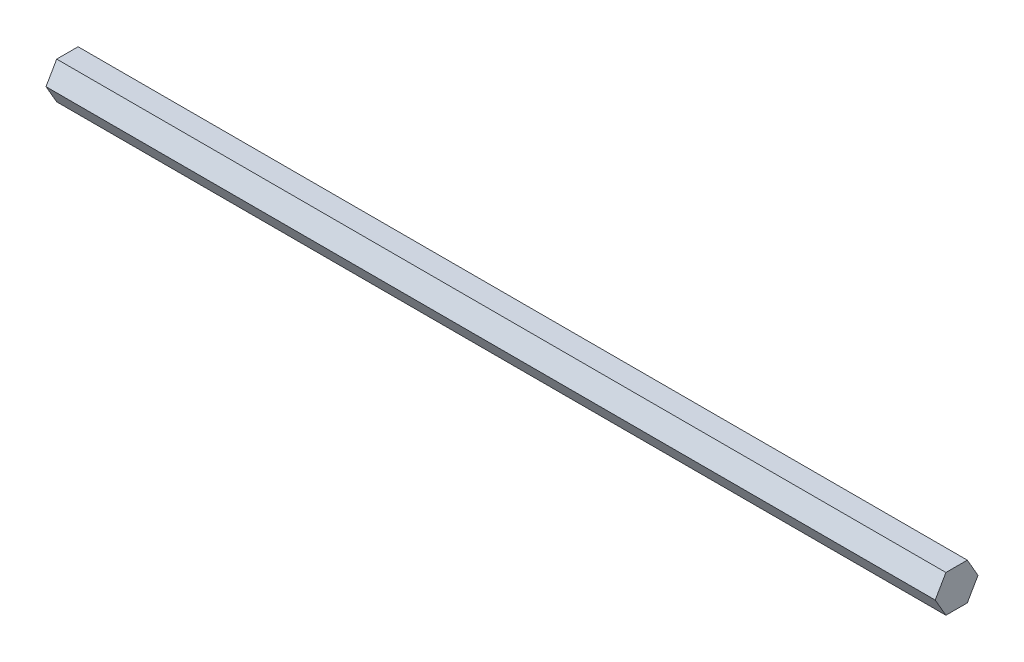
ISO-10303-21;
HEADER;
FILE_DESCRIPTION(('STEP AP214'),'2;1');
FILE_NAME('part.step','',(''),(''),'','','');
FILE_SCHEMA(('AUTOMOTIVE_DESIGN { 1 0 10303 214 1 1 1 1 }'));
ENDSEC;
DATA;
#1=APPLICATION_CONTEXT('core data for automotive mechanical design processes');
#2=APPLICATION_PROTOCOL_DEFINITION('international standard','automotive_design',2000,#1);
#3=PRODUCT_CONTEXT('',#1,'mechanical');
#4=PRODUCT('Part','Part','',(#3));
#5=PRODUCT_RELATED_PRODUCT_CATEGORY('part','',(#4));
#6=PRODUCT_DEFINITION_FORMATION('','',#4);
#7=PRODUCT_DEFINITION_CONTEXT('part definition',#1,'design');
#8=PRODUCT_DEFINITION('design','',#6,#7);
#9=PRODUCT_DEFINITION_SHAPE('','',#8);
#10=(LENGTH_UNIT() NAMED_UNIT(*) SI_UNIT(.MILLI.,.METRE.));
#11=(NAMED_UNIT(*) PLANE_ANGLE_UNIT() SI_UNIT($,.RADIAN.));
#12=(NAMED_UNIT(*) SI_UNIT($,.STERADIAN.) SOLID_ANGLE_UNIT());
#13=UNCERTAINTY_MEASURE_WITH_UNIT(LENGTH_MEASURE(1.E-05),#10,'distance_accuracy_value','');
#14=(GEOMETRIC_REPRESENTATION_CONTEXT(3) GLOBAL_UNCERTAINTY_ASSIGNED_CONTEXT((#13)) GLOBAL_UNIT_ASSIGNED_CONTEXT((#10,
#11,#12)) REPRESENTATION_CONTEXT('',''));
#15=CARTESIAN_POINT('',(0.,0.,0.));
#16=DIRECTION('',(0.,0.,1.));
#17=DIRECTION('',(1.,0.,0.));
#18=AXIS2_PLACEMENT_3D('',#15,#16,#17);
#19=CARTESIAN_POINT('',(152.4,0.,-7.33234841870825));
#20=DIRECTION('',(0.,-0.5,0.866025403784438));
#21=DIRECTION('',(0.,-0.866025403784438,-0.5));
#22=AXIS2_PLACEMENT_3D('',#19,#20,#21);
#23=PLANE('',#22);
#24=DIRECTION('',(0.,0.866025403784438,0.5));
#25=VECTOR('',#24,1.);
#26=CARTESIAN_POINT('',(-152.4,0.,-7.33234841870825));
#27=LINE('',#26,#25);
#28=CARTESIAN_POINT('',(-152.4,0.,-7.33234841870825));
#29=VERTEX_POINT('',#28);
#30=CARTESIAN_POINT('',(-152.4,6.35,-3.66617420935412));
#31=VERTEX_POINT('',#30);
#32=EDGE_CURVE('E128',#29,#31,#27,.T.);
#33=ORIENTED_EDGE('',*,*,#32,.T.);
#34=DIRECTION('',(-1.,0.,0.));
#35=VECTOR('',#34,1.);
#36=CARTESIAN_POINT('',(152.4,6.35,-3.66617420935412));
#37=LINE('',#36,#35);
#38=CARTESIAN_POINT('',(152.4,6.35,-3.66617420935412));
#39=VERTEX_POINT('',#38);
#40=EDGE_CURVE('E11',#39,#31,#37,.T.);
#41=ORIENTED_EDGE('',*,*,#40,.F.);
#42=DIRECTION('',(0.,0.866025403784438,0.5));
#43=VECTOR('',#42,1.);
#44=CARTESIAN_POINT('',(152.4,0.,-7.33234841870825));
#45=LINE('',#44,#43);
#46=CARTESIAN_POINT('',(152.4,0.,-7.33234841870825));
#47=VERTEX_POINT('',#46);
#48=EDGE_CURVE('E144',#47,#39,#45,.T.);
#49=ORIENTED_EDGE('',*,*,#48,.F.);
#50=DIRECTION('',(-1.,0.,0.));
#51=VECTOR('',#50,1.);
#52=CARTESIAN_POINT('',(152.4,0.,-7.33234841870825));
#53=LINE('',#52,#51);
#54=EDGE_CURVE('E124',#47,#29,#53,.T.);
#55=ORIENTED_EDGE('',*,*,#54,.T.);
#56=EDGE_LOOP('',(#33,#41,#49,#55));
#57=FACE_BOUND('',#56,.T.);
#58=ADVANCED_FACE('F39',(#57),#23,.F.);
#59=CARTESIAN_POINT('',(152.4,6.35,-3.66617420935412));
#60=DIRECTION('',(0.,-1.,0.));
#61=DIRECTION('',(0.,0.,-1.));
#62=AXIS2_PLACEMENT_3D('',#59,#60,#61);
#63=PLANE('',#62);
#64=DIRECTION('',(0.,0.,1.));
#65=VECTOR('',#64,1.);
#66=CARTESIAN_POINT('',(-152.4,6.35,-3.66617420935412));
#67=LINE('',#66,#65);
#68=CARTESIAN_POINT('',(-152.4,6.35,3.66617420935412));
#69=VERTEX_POINT('',#68);
#70=EDGE_CURVE('E132',#31,#69,#67,.T.);
#71=ORIENTED_EDGE('',*,*,#70,.T.);
#72=DIRECTION('',(-1.,0.,0.));
#73=VECTOR('',#72,1.);
#74=CARTESIAN_POINT('',(152.4,6.35,3.66617420935412));
#75=LINE('',#74,#73);
#76=CARTESIAN_POINT('',(152.4,6.35,3.66617420935412));
#77=VERTEX_POINT('',#76);
#78=EDGE_CURVE('E48',#77,#69,#75,.T.);
#79=ORIENTED_EDGE('',*,*,#78,.F.);
#80=DIRECTION('',(0.,0.,1.));
#81=VECTOR('',#80,1.);
#82=CARTESIAN_POINT('',(152.4,6.35,-3.66617420935412));
#83=LINE('',#82,#81);
#84=EDGE_CURVE('E93',#39,#77,#83,.T.);
#85=ORIENTED_EDGE('',*,*,#84,.F.);
#86=ORIENTED_EDGE('',*,*,#40,.T.);
#87=EDGE_LOOP('',(#71,#79,#85,#86));
#88=FACE_BOUND('',#87,.T.);
#89=ADVANCED_FACE('F172',(#88),#63,.F.);
#90=CARTESIAN_POINT('',(152.4,6.35,3.66617420935412));
#91=DIRECTION('',(0.,-0.5,-0.866025403784439));
#92=DIRECTION('',(0.,0.866025403784439,-0.5));
#93=AXIS2_PLACEMENT_3D('',#90,#91,#92);
#94=PLANE('',#93);
#95=DIRECTION('',(0.,-0.866025403784439,0.5));
#96=VECTOR('',#95,1.);
#97=CARTESIAN_POINT('',(-152.4,6.35,3.66617420935412));
#98=LINE('',#97,#96);
#99=CARTESIAN_POINT('',(-152.4,0.,7.33234841870824));
#100=VERTEX_POINT('',#99);
#101=EDGE_CURVE('E135',#69,#100,#98,.T.);
#102=ORIENTED_EDGE('',*,*,#101,.T.);
#103=DIRECTION('',(-1.,0.,0.));
#104=VECTOR('',#103,1.);
#105=CARTESIAN_POINT('',(152.4,0.,7.33234841870824));
#106=LINE('',#105,#104);
#107=CARTESIAN_POINT('',(152.4,0.,7.33234841870824));
#108=VERTEX_POINT('',#107);
#109=EDGE_CURVE('E117',#108,#100,#106,.T.);
#110=ORIENTED_EDGE('',*,*,#109,.F.);
#111=DIRECTION('',(0.,-0.866025403784439,0.5));
#112=VECTOR('',#111,1.);
#113=CARTESIAN_POINT('',(152.4,6.35,3.66617420935412));
#114=LINE('',#113,#112);
#115=EDGE_CURVE('E106',#77,#108,#114,.T.);
#116=ORIENTED_EDGE('',*,*,#115,.F.);
#117=ORIENTED_EDGE('',*,*,#78,.T.);
#118=EDGE_LOOP('',(#102,#110,#116,#117));
#119=FACE_BOUND('',#118,.T.);
#120=ADVANCED_FACE('F154',(#119),#94,.F.);
#121=CARTESIAN_POINT('',(152.4,0.,7.33234841870824));
#122=DIRECTION('',(0.,0.5,-0.866025403784438));
#123=DIRECTION('',(0.,0.866025403784438,0.5));
#124=AXIS2_PLACEMENT_3D('',#121,#122,#123);
#125=PLANE('',#124);
#126=DIRECTION('',(0.,-0.866025403784438,-0.5));
#127=VECTOR('',#126,1.);
#128=CARTESIAN_POINT('',(-152.4,0.,7.33234841870824));
#129=LINE('',#128,#127);
#130=CARTESIAN_POINT('',(-152.4,-6.35,3.66617420935412));
#131=VERTEX_POINT('',#130);
#132=EDGE_CURVE('E115',#100,#131,#129,.T.);
#133=ORIENTED_EDGE('',*,*,#132,.T.);
#134=DIRECTION('',(-1.,0.,0.));
#135=VECTOR('',#134,1.);
#136=CARTESIAN_POINT('',(152.4,-6.35,3.66617420935412));
#137=LINE('',#136,#135);
#138=CARTESIAN_POINT('',(152.4,-6.35,3.66617420935412));
#139=VERTEX_POINT('',#138);
#140=EDGE_CURVE('E112',#139,#131,#137,.T.);
#141=ORIENTED_EDGE('',*,*,#140,.F.);
#142=DIRECTION('',(0.,-0.866025403784438,-0.5));
#143=VECTOR('',#142,1.);
#144=CARTESIAN_POINT('',(152.4,0.,7.33234841870824));
#145=LINE('',#144,#143);
#146=EDGE_CURVE('E100',#108,#139,#145,.T.);
#147=ORIENTED_EDGE('',*,*,#146,.F.);
#148=ORIENTED_EDGE('',*,*,#109,.T.);
#149=EDGE_LOOP('',(#133,#141,#147,#148));
#150=FACE_BOUND('',#149,.T.);
#151=ADVANCED_FACE('F113',(#150),#125,.F.);
#152=CARTESIAN_POINT('',(152.4,-6.35,3.66617420935412));
#153=DIRECTION('',(0.,1.,0.));
#154=DIRECTION('',(0.,0.,1.));
#155=AXIS2_PLACEMENT_3D('',#152,#153,#154);
#156=PLANE('',#155);
#157=DIRECTION('',(0.,0.,-1.));
#158=VECTOR('',#157,1.);
#159=CARTESIAN_POINT('',(-152.4,-6.35,3.66617420935412));
#160=LINE('',#159,#158);
#161=CARTESIAN_POINT('',(-152.4,-6.35,-3.66617420935413));
#162=VERTEX_POINT('',#161);
#163=EDGE_CURVE('E79',#131,#162,#160,.T.);
#164=ORIENTED_EDGE('',*,*,#163,.T.);
#165=DIRECTION('',(-1.,0.,0.));
#166=VECTOR('',#165,1.);
#167=CARTESIAN_POINT('',(152.4,-6.35,-3.66617420935413));
#168=LINE('',#167,#166);
#169=CARTESIAN_POINT('',(152.4,-6.35,-3.66617420935413));
#170=VERTEX_POINT('',#169);
#171=EDGE_CURVE('E118',#170,#162,#168,.T.);
#172=ORIENTED_EDGE('',*,*,#171,.F.);
#173=DIRECTION('',(0.,0.,-1.));
#174=VECTOR('',#173,1.);
#175=CARTESIAN_POINT('',(152.4,-6.35,3.66617420935412));
#176=LINE('',#175,#174);
#177=EDGE_CURVE('E104',#139,#170,#176,.T.);
#178=ORIENTED_EDGE('',*,*,#177,.F.);
#179=ORIENTED_EDGE('',*,*,#140,.T.);
#180=EDGE_LOOP('',(#164,#172,#178,#179));
#181=FACE_BOUND('',#180,.T.);
#182=ADVANCED_FACE('F120',(#181),#156,.F.);
#183=CARTESIAN_POINT('',(152.4,-6.35,-3.66617420935413));
#184=DIRECTION('',(0.,0.5,0.866025403784439));
#185=DIRECTION('',(0.,-0.866025403784439,0.5));
#186=AXIS2_PLACEMENT_3D('',#183,#184,#185);
#187=PLANE('',#186);
#188=DIRECTION('',(0.,0.866025403784439,-0.5));
#189=VECTOR('',#188,1.);
#190=CARTESIAN_POINT('',(-152.4,-6.35,-3.66617420935413));
#191=LINE('',#190,#189);
#192=EDGE_CURVE('E85',#162,#29,#191,.T.);
#193=ORIENTED_EDGE('',*,*,#192,.T.);
#194=ORIENTED_EDGE('',*,*,#54,.F.);
#195=DIRECTION('',(0.,0.866025403784439,-0.5));
#196=VECTOR('',#195,1.);
#197=CARTESIAN_POINT('',(152.4,-6.35,-3.66617420935413));
#198=LINE('',#197,#196);
#199=EDGE_CURVE('E56',#170,#47,#198,.T.);
#200=ORIENTED_EDGE('',*,*,#199,.F.);
#201=ORIENTED_EDGE('',*,*,#171,.T.);
#202=EDGE_LOOP('',(#193,#194,#200,#201));
#203=FACE_BOUND('',#202,.T.);
#204=ADVANCED_FACE('F161',(#203),#187,.F.);
#205=CARTESIAN_POINT('',(152.4,0.,0.));
#206=DIRECTION('',(1.,0.,0.));
#207=DIRECTION('',(0.,0.,-1.));
#208=AXIS2_PLACEMENT_3D('',#205,#206,#207);
#209=PLANE('',#208);
#210=ORIENTED_EDGE('',*,*,#48,.T.);
#211=ORIENTED_EDGE('',*,*,#84,.T.);
#212=ORIENTED_EDGE('',*,*,#115,.T.);
#213=ORIENTED_EDGE('',*,*,#146,.T.);
#214=ORIENTED_EDGE('',*,*,#177,.T.);
#215=ORIENTED_EDGE('',*,*,#199,.T.);
#216=EDGE_LOOP('',(#210,#211,#212,#213,#214,#215));
#217=FACE_BOUND('',#216,.T.);
#218=ADVANCED_FACE('F102',(#217),#209,.T.);
#219=CARTESIAN_POINT('',(-152.4,0.,0.));
#220=DIRECTION('',(1.,0.,0.));
#221=DIRECTION('',(0.,0.,-1.));
#222=AXIS2_PLACEMENT_3D('',#219,#220,#221);
#223=PLANE('',#222);
#224=ORIENTED_EDGE('',*,*,#32,.F.);
#225=ORIENTED_EDGE('',*,*,#192,.F.);
#226=ORIENTED_EDGE('',*,*,#163,.F.);
#227=ORIENTED_EDGE('',*,*,#132,.F.);
#228=ORIENTED_EDGE('',*,*,#101,.F.);
#229=ORIENTED_EDGE('',*,*,#70,.F.);
#230=EDGE_LOOP('',(#224,#225,#226,#227,#228,#229));
#231=FACE_BOUND('',#230,.T.);
#232=ADVANCED_FACE('F157',(#231),#223,.F.);
#233=CLOSED_SHELL('',(#58,#89,#120,#151,#182,#204,#218,#232));
#234=MANIFOLD_SOLID_BREP('B2',#233);
#235=ADVANCED_BREP_SHAPE_REPRESENTATION('',(#18,#234),#14);
#236=SHAPE_DEFINITION_REPRESENTATION(#9,#235);
ENDSEC;
END-ISO-10303-21;
